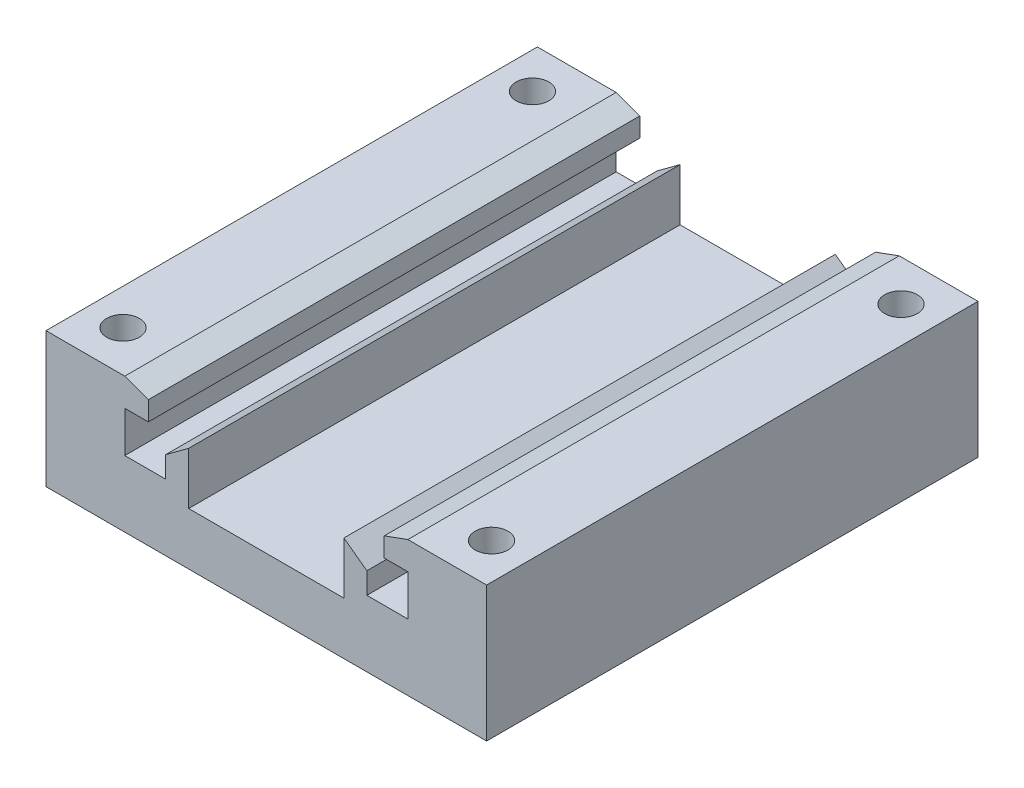
ISO-10303-21;
HEADER;
FILE_DESCRIPTION(('STEP AP214'),'2;1');
FILE_NAME('part.step','',(''),(''),'','','');
FILE_SCHEMA(('AUTOMOTIVE_DESIGN { 1 0 10303 214 1 1 1 1 }'));
ENDSEC;
DATA;
#1=APPLICATION_CONTEXT('core data for automotive mechanical design processes');
#2=APPLICATION_PROTOCOL_DEFINITION('international standard','automotive_design',2000,#1);
#3=PRODUCT_CONTEXT('',#1,'mechanical');
#4=PRODUCT('Part','Part','',(#3));
#5=PRODUCT_RELATED_PRODUCT_CATEGORY('part','',(#4));
#6=PRODUCT_DEFINITION_FORMATION('','',#4);
#7=PRODUCT_DEFINITION_CONTEXT('part definition',#1,'design');
#8=PRODUCT_DEFINITION('design','',#6,#7);
#9=PRODUCT_DEFINITION_SHAPE('','',#8);
#10=(LENGTH_UNIT() NAMED_UNIT(*) SI_UNIT(.MILLI.,.METRE.));
#11=(NAMED_UNIT(*) PLANE_ANGLE_UNIT() SI_UNIT($,.RADIAN.));
#12=(NAMED_UNIT(*) SI_UNIT($,.STERADIAN.) SOLID_ANGLE_UNIT());
#13=UNCERTAINTY_MEASURE_WITH_UNIT(LENGTH_MEASURE(1.E-05),#10,'distance_accuracy_value','');
#14=(GEOMETRIC_REPRESENTATION_CONTEXT(3) GLOBAL_UNCERTAINTY_ASSIGNED_CONTEXT((#13)) GLOBAL_UNIT_ASSIGNED_CONTEXT((#10,
#11,#12)) REPRESENTATION_CONTEXT('',''));
#15=CARTESIAN_POINT('',(0.,0.,0.));
#16=DIRECTION('',(0.,0.,1.));
#17=DIRECTION('',(1.,0.,0.));
#18=AXIS2_PLACEMENT_3D('',#15,#16,#17);
#19=CARTESIAN_POINT('',(53.8,16.5,-60.));
#20=DIRECTION('',(0.,1.,0.));
#21=DIRECTION('',(-1.,0.,0.));
#22=AXIS2_PLACEMENT_3D('',#19,#20,#21);
#23=PLANE('',#22);
#24=CARTESIAN_POINT('',(4.39999999999999,16.5,-55.));
#25=DIRECTION('',(0.,-1.,0.));
#26=DIRECTION('',(0.,0.,-1.));
#27=AXIS2_PLACEMENT_3D('',#24,#25,#26);
#28=CIRCLE('',#27,2.);
#29=CARTESIAN_POINT('',(4.39999999999999,16.5,-57.));
#30=VERTEX_POINT('',#29);
#31=EDGE_CURVE('E495',#30,#30,#28,.T.);
#32=ORIENTED_EDGE('',*,*,#31,.T.);
#33=EDGE_LOOP('',(#32));
#34=FACE_BOUND('',#33,.T.);
#35=DIRECTION('',(-1.,0.,0.));
#36=VECTOR('',#35,1.);
#37=CARTESIAN_POINT('',(53.8,16.5,0.));
#38=LINE('',#37,#36);
#39=CARTESIAN_POINT('',(9.62,16.5,0.));
#40=VERTEX_POINT('',#39);
#41=CARTESIAN_POINT('',(0.,16.5,0.));
#42=VERTEX_POINT('',#41);
#43=EDGE_CURVE('E402',#40,#42,#38,.T.);
#44=ORIENTED_EDGE('',*,*,#43,.F.);
#45=DIRECTION('',(0.,0.,1.));
#46=VECTOR('',#45,1.);
#47=CARTESIAN_POINT('',(9.62,16.5,-60.));
#48=LINE('',#47,#46);
#49=CARTESIAN_POINT('',(9.62,16.5,-60.));
#50=VERTEX_POINT('',#49);
#51=EDGE_CURVE('E416',#50,#40,#48,.T.);
#52=ORIENTED_EDGE('',*,*,#51,.F.);
#53=DIRECTION('',(-1.,0.,0.));
#54=VECTOR('',#53,1.);
#55=CARTESIAN_POINT('',(53.8,16.5,-60.));
#56=LINE('',#55,#54);
#57=CARTESIAN_POINT('',(0.,16.5,-60.));
#58=VERTEX_POINT('',#57);
#59=EDGE_CURVE('E465',#50,#58,#56,.T.);
#60=ORIENTED_EDGE('',*,*,#59,.T.);
#61=DIRECTION('',(0.,0.,1.));
#62=VECTOR('',#61,1.);
#63=CARTESIAN_POINT('',(0.,16.5,-60.));
#64=LINE('',#63,#62);
#65=EDGE_CURVE('E414',#58,#42,#64,.T.);
#66=ORIENTED_EDGE('',*,*,#65,.T.);
#67=EDGE_LOOP('',(#44,#52,#60,#66));
#68=FACE_BOUND('',#67,.T.);
#69=CARTESIAN_POINT('',(4.39999999999999,16.5,-5.));
#70=DIRECTION('',(0.,-1.,0.));
#71=DIRECTION('',(0.,0.,-1.));
#72=AXIS2_PLACEMENT_3D('',#69,#70,#71);
#73=CIRCLE('',#72,2.);
#74=CARTESIAN_POINT('',(4.39999999999999,16.5,-7.));
#75=VERTEX_POINT('',#74);
#76=EDGE_CURVE('E486',#75,#75,#73,.T.);
#77=ORIENTED_EDGE('',*,*,#76,.T.);
#78=EDGE_LOOP('',(#77));
#79=FACE_BOUND('',#78,.T.);
#80=ADVANCED_FACE('F40',(#34,#68,#79),#23,.T.);
#81=CARTESIAN_POINT('',(39.18,0.,-60.));
#82=DIRECTION('',(-1.,0.,0.));
#83=DIRECTION('',(0.,0.,1.));
#84=AXIS2_PLACEMENT_3D('',#81,#82,#83);
#85=PLANE('',#84);
#86=DIRECTION('',(0.,-1.,0.));
#87=VECTOR('',#86,1.);
#88=CARTESIAN_POINT('',(39.18,0.,0.));
#89=LINE('',#88,#87);
#90=CARTESIAN_POINT('',(39.18,10.7,0.));
#91=VERTEX_POINT('',#90);
#92=CARTESIAN_POINT('',(39.18,8.1,0.));
#93=VERTEX_POINT('',#92);
#94=EDGE_CURVE('E158',#91,#93,#89,.T.);
#95=ORIENTED_EDGE('',*,*,#94,.T.);
#96=DIRECTION('',(0.,0.,1.));
#97=VECTOR('',#96,1.);
#98=CARTESIAN_POINT('',(39.18,8.1,-60.));
#99=LINE('',#98,#97);
#100=CARTESIAN_POINT('',(39.18,8.1,-60.));
#101=VERTEX_POINT('',#100);
#102=EDGE_CURVE('E11',#101,#93,#99,.T.);
#103=ORIENTED_EDGE('',*,*,#102,.F.);
#104=DIRECTION('',(0.,-1.,0.));
#105=VECTOR('',#104,1.);
#106=CARTESIAN_POINT('',(39.18,0.,-60.));
#107=LINE('',#106,#105);
#108=CARTESIAN_POINT('',(39.18,10.7,-60.));
#109=VERTEX_POINT('',#108);
#110=EDGE_CURVE('E59',#109,#101,#107,.T.);
#111=ORIENTED_EDGE('',*,*,#110,.F.);
#112=DIRECTION('',(0.,0.,1.));
#113=VECTOR('',#112,1.);
#114=CARTESIAN_POINT('',(39.18,10.7,-60.));
#115=LINE('',#114,#113);
#116=EDGE_CURVE('E44',#109,#91,#115,.T.);
#117=ORIENTED_EDGE('',*,*,#116,.T.);
#118=EDGE_LOOP('',(#95,#103,#111,#117));
#119=FACE_BOUND('',#118,.T.);
#120=ADVANCED_FACE('F42',(#119),#85,.F.);
#121=CARTESIAN_POINT('',(0.,8.1,-60.));
#122=DIRECTION('',(0.,1.,0.));
#123=DIRECTION('',(0.,0.,1.));
#124=AXIS2_PLACEMENT_3D('',#121,#122,#123);
#125=PLANE('',#124);
#126=DIRECTION('',(-1.,0.,0.));
#127=VECTOR('',#126,1.);
#128=CARTESIAN_POINT('',(0.,8.1,0.));
#129=LINE('',#128,#127);
#130=CARTESIAN_POINT('',(44.18,8.1,0.));
#131=VERTEX_POINT('',#130);
#132=EDGE_CURVE('E188',#131,#93,#129,.T.);
#133=ORIENTED_EDGE('',*,*,#132,.F.);
#134=DIRECTION('',(0.,0.,1.));
#135=VECTOR('',#134,1.);
#136=CARTESIAN_POINT('',(44.18,8.1,-60.));
#137=LINE('',#136,#135);
#138=CARTESIAN_POINT('',(44.18,8.1,-60.));
#139=VERTEX_POINT('',#138);
#140=EDGE_CURVE('E50',#139,#131,#137,.T.);
#141=ORIENTED_EDGE('',*,*,#140,.F.);
#142=DIRECTION('',(-1.,0.,0.));
#143=VECTOR('',#142,1.);
#144=CARTESIAN_POINT('',(0.,8.1,-60.));
#145=LINE('',#144,#143);
#146=EDGE_CURVE('E153',#139,#101,#145,.T.);
#147=ORIENTED_EDGE('',*,*,#146,.T.);
#148=ORIENTED_EDGE('',*,*,#102,.T.);
#149=EDGE_LOOP('',(#133,#141,#147,#148));
#150=FACE_BOUND('',#149,.T.);
#151=ADVANCED_FACE('F226',(#150),#125,.T.);
#152=CARTESIAN_POINT('',(44.18,0.,-60.));
#153=DIRECTION('',(-1.,0.,0.));
#154=DIRECTION('',(0.,0.,1.));
#155=AXIS2_PLACEMENT_3D('',#152,#153,#154);
#156=PLANE('',#155);
#157=DIRECTION('',(0.,-1.,0.));
#158=VECTOR('',#157,1.);
#159=CARTESIAN_POINT('',(44.18,0.,0.));
#160=LINE('',#159,#158);
#161=CARTESIAN_POINT('',(44.18,13.1,0.));
#162=VERTEX_POINT('',#161);
#163=EDGE_CURVE('E139',#162,#131,#160,.T.);
#164=ORIENTED_EDGE('',*,*,#163,.F.);
#165=DIRECTION('',(0.,0.,1.));
#166=VECTOR('',#165,1.);
#167=CARTESIAN_POINT('',(44.18,13.1,-60.));
#168=LINE('',#167,#166);
#169=CARTESIAN_POINT('',(44.18,13.1,-60.));
#170=VERTEX_POINT('',#169);
#171=EDGE_CURVE('E134',#170,#162,#168,.T.);
#172=ORIENTED_EDGE('',*,*,#171,.F.);
#173=DIRECTION('',(0.,-1.,0.));
#174=VECTOR('',#173,1.);
#175=CARTESIAN_POINT('',(44.18,0.,-60.));
#176=LINE('',#175,#174);
#177=EDGE_CURVE('E138',#170,#139,#176,.T.);
#178=ORIENTED_EDGE('',*,*,#177,.T.);
#179=ORIENTED_EDGE('',*,*,#140,.T.);
#180=EDGE_LOOP('',(#164,#172,#178,#179));
#181=FACE_BOUND('',#180,.T.);
#182=ADVANCED_FACE('F136',(#181),#156,.T.);
#183=CARTESIAN_POINT('',(0.,13.1,-60.));
#184=DIRECTION('',(0.,1.,0.));
#185=DIRECTION('',(0.,0.,1.));
#186=AXIS2_PLACEMENT_3D('',#183,#184,#185);
#187=PLANE('',#186);
#188=DIRECTION('',(-1.,0.,0.));
#189=VECTOR('',#188,1.);
#190=CARTESIAN_POINT('',(0.,13.1,0.));
#191=LINE('',#190,#189);
#192=CARTESIAN_POINT('',(41.3,13.1,0.));
#193=VERTEX_POINT('',#192);
#194=EDGE_CURVE('E185',#162,#193,#191,.T.);
#195=ORIENTED_EDGE('',*,*,#194,.T.);
#196=DIRECTION('',(0.,0.,1.));
#197=VECTOR('',#196,1.);
#198=CARTESIAN_POINT('',(41.3,13.1,-60.));
#199=LINE('',#198,#197);
#200=CARTESIAN_POINT('',(41.3,13.1,-60.));
#201=VERTEX_POINT('',#200);
#202=EDGE_CURVE('E143',#201,#193,#199,.T.);
#203=ORIENTED_EDGE('',*,*,#202,.F.);
#204=DIRECTION('',(-1.,0.,0.));
#205=VECTOR('',#204,1.);
#206=CARTESIAN_POINT('',(0.,13.1,-60.));
#207=LINE('',#206,#205);
#208=EDGE_CURVE('E146',#170,#201,#207,.T.);
#209=ORIENTED_EDGE('',*,*,#208,.F.);
#210=ORIENTED_EDGE('',*,*,#171,.T.);
#211=EDGE_LOOP('',(#195,#203,#209,#210));
#212=FACE_BOUND('',#211,.T.);
#213=ADVANCED_FACE('F147',(#212),#187,.F.);
#214=CARTESIAN_POINT('',(41.3,0.,-60.));
#215=DIRECTION('',(-1.,0.,0.));
#216=DIRECTION('',(0.,0.,1.));
#217=AXIS2_PLACEMENT_3D('',#214,#215,#216);
#218=PLANE('',#217);
#219=DIRECTION('',(0.,-1.,0.));
#220=VECTOR('',#219,1.);
#221=CARTESIAN_POINT('',(41.3,0.,0.));
#222=LINE('',#221,#220);
#223=CARTESIAN_POINT('',(41.3,15.4517657253134,0.));
#224=VERTEX_POINT('',#223);
#225=EDGE_CURVE('E182',#224,#193,#222,.T.);
#226=ORIENTED_EDGE('',*,*,#225,.F.);
#227=DIRECTION('',(0.,0.,1.));
#228=VECTOR('',#227,1.);
#229=CARTESIAN_POINT('',(41.3,15.4517657253134,-60.));
#230=LINE('',#229,#228);
#231=CARTESIAN_POINT('',(41.3,15.4517657253134,-60.));
#232=VERTEX_POINT('',#231);
#233=EDGE_CURVE('E193',#232,#224,#230,.T.);
#234=ORIENTED_EDGE('',*,*,#233,.F.);
#235=DIRECTION('',(0.,-1.,0.));
#236=VECTOR('',#235,1.);
#237=CARTESIAN_POINT('',(41.3,0.,-60.));
#238=LINE('',#237,#236);
#239=EDGE_CURVE('E150',#232,#201,#238,.T.);
#240=ORIENTED_EDGE('',*,*,#239,.T.);
#241=ORIENTED_EDGE('',*,*,#202,.T.);
#242=EDGE_LOOP('',(#226,#234,#240,#241));
#243=FACE_BOUND('',#242,.T.);
#244=ADVANCED_FACE('F267',(#243),#218,.T.);
#245=CARTESIAN_POINT('',(-0.134919528412264,0.370688357756169,-60.));
#246=DIRECTION('',(-0.342020143325663,0.93969262078591,0.));
#247=DIRECTION('',(-0.93969262078591,-0.342020143325663,0.));
#248=AXIS2_PLACEMENT_3D('',#245,#246,#247);
#249=PLANE('',#248);
#250=DIRECTION('',(-0.93969262078591,-0.342020143325663,0.));
#251=VECTOR('',#250,1.);
#252=CARTESIAN_POINT('',(-0.134919528412264,0.370688357756169,0.));
#253=LINE('',#252,#251);
#254=CARTESIAN_POINT('',(44.18,16.5,0.));
#255=VERTEX_POINT('',#254);
#256=EDGE_CURVE('E179',#255,#224,#253,.T.);
#257=ORIENTED_EDGE('',*,*,#256,.F.);
#258=DIRECTION('',(0.,0.,1.));
#259=VECTOR('',#258,1.);
#260=CARTESIAN_POINT('',(44.18,16.5,-60.));
#261=LINE('',#260,#259);
#262=CARTESIAN_POINT('',(44.18,16.5,-60.));
#263=VERTEX_POINT('',#262);
#264=EDGE_CURVE('E195',#263,#255,#261,.T.);
#265=ORIENTED_EDGE('',*,*,#264,.F.);
#266=DIRECTION('',(-0.93969262078591,-0.342020143325663,0.));
#267=VECTOR('',#266,1.);
#268=CARTESIAN_POINT('',(-0.134919528412264,0.370688357756169,-60.));
#269=LINE('',#268,#267);
#270=EDGE_CURVE('E444',#263,#232,#269,.T.);
#271=ORIENTED_EDGE('',*,*,#270,.T.);
#272=ORIENTED_EDGE('',*,*,#233,.T.);
#273=EDGE_LOOP('',(#257,#265,#271,#272));
#274=FACE_BOUND('',#273,.T.);
#275=ADVANCED_FACE('F270',(#274),#249,.T.);
#276=CARTESIAN_POINT('',(0.,16.5,-60.));
#277=DIRECTION('',(0.,-1.,0.));
#278=DIRECTION('',(0.,0.,-1.));
#279=AXIS2_PLACEMENT_3D('',#276,#277,#278);
#280=PLANE('',#279);
#281=CARTESIAN_POINT('',(49.4,16.5,-55.));
#282=DIRECTION('',(0.,-1.,0.));
#283=DIRECTION('',(0.,0.,-1.));
#284=AXIS2_PLACEMENT_3D('',#281,#282,#283);
#285=CIRCLE('',#284,1.99999999999999);
#286=CARTESIAN_POINT('',(49.4,16.5,-57.));
#287=VERTEX_POINT('',#286);
#288=EDGE_CURVE('E503',#287,#287,#285,.T.);
#289=ORIENTED_EDGE('',*,*,#288,.T.);
#290=EDGE_LOOP('',(#289));
#291=FACE_BOUND('',#290,.T.);
#292=CARTESIAN_POINT('',(49.4,16.5,-5.));
#293=DIRECTION('',(0.,-1.,0.));
#294=DIRECTION('',(0.,0.,-1.));
#295=AXIS2_PLACEMENT_3D('',#292,#293,#294);
#296=CIRCLE('',#295,1.99999999999999);
#297=CARTESIAN_POINT('',(49.4,16.5,-6.99999999999999));
#298=VERTEX_POINT('',#297);
#299=EDGE_CURVE('E383',#298,#298,#296,.T.);
#300=ORIENTED_EDGE('',*,*,#299,.T.);
#301=EDGE_LOOP('',(#300));
#302=FACE_BOUND('',#301,.T.);
#303=DIRECTION('',(1.,0.,0.));
#304=VECTOR('',#303,1.);
#305=CARTESIAN_POINT('',(0.,16.5,0.));
#306=LINE('',#305,#304);
#307=CARTESIAN_POINT('',(53.8,16.5,0.));
#308=VERTEX_POINT('',#307);
#309=EDGE_CURVE('E176',#255,#308,#306,.T.);
#310=ORIENTED_EDGE('',*,*,#309,.T.);
#311=DIRECTION('',(0.,0.,1.));
#312=VECTOR('',#311,1.);
#313=CARTESIAN_POINT('',(53.8,16.5,-60.));
#314=LINE('',#313,#312);
#315=CARTESIAN_POINT('',(53.8,16.5,-60.));
#316=VERTEX_POINT('',#315);
#317=EDGE_CURVE('E197',#316,#308,#314,.T.);
#318=ORIENTED_EDGE('',*,*,#317,.F.);
#319=DIRECTION('',(1.,0.,0.));
#320=VECTOR('',#319,1.);
#321=CARTESIAN_POINT('',(0.,16.5,-60.));
#322=LINE('',#321,#320);
#323=EDGE_CURVE('E442',#263,#316,#322,.T.);
#324=ORIENTED_EDGE('',*,*,#323,.F.);
#325=ORIENTED_EDGE('',*,*,#264,.T.);
#326=EDGE_LOOP('',(#310,#318,#324,#325));
#327=FACE_BOUND('',#326,.T.);
#328=ADVANCED_FACE('F274',(#291,#302,#327),#280,.F.);
#329=CARTESIAN_POINT('',(53.8,0.,-60.));
#330=DIRECTION('',(1.,0.,0.));
#331=DIRECTION('',(0.,1.,0.));
#332=AXIS2_PLACEMENT_3D('',#329,#330,#331);
#333=PLANE('',#332);
#334=DIRECTION('',(0.,1.,0.));
#335=VECTOR('',#334,1.);
#336=CARTESIAN_POINT('',(53.8,0.,0.));
#337=LINE('',#336,#335);
#338=CARTESIAN_POINT('',(53.8,0.,0.));
#339=VERTEX_POINT('',#338);
#340=EDGE_CURVE('E173',#339,#308,#337,.T.);
#341=ORIENTED_EDGE('',*,*,#340,.F.);
#342=DIRECTION('',(0.,0.,1.));
#343=VECTOR('',#342,1.);
#344=CARTESIAN_POINT('',(53.8,0.,-60.));
#345=LINE('',#344,#343);
#346=CARTESIAN_POINT('',(53.8,0.,-60.));
#347=VERTEX_POINT('',#346);
#348=EDGE_CURVE('E199',#347,#339,#345,.T.);
#349=ORIENTED_EDGE('',*,*,#348,.F.);
#350=DIRECTION('',(0.,1.,0.));
#351=VECTOR('',#350,1.);
#352=CARTESIAN_POINT('',(53.8,0.,-60.));
#353=LINE('',#352,#351);
#354=EDGE_CURVE('E439',#347,#316,#353,.T.);
#355=ORIENTED_EDGE('',*,*,#354,.T.);
#356=ORIENTED_EDGE('',*,*,#317,.T.);
#357=EDGE_LOOP('',(#341,#349,#355,#356));
#358=FACE_BOUND('',#357,.T.);
#359=ADVANCED_FACE('F278',(#358),#333,.T.);
#360=CARTESIAN_POINT('',(0.,0.,-60.));
#361=DIRECTION('',(0.,-1.,0.));
#362=DIRECTION('',(0.,0.,-1.));
#363=AXIS2_PLACEMENT_3D('',#360,#361,#362);
#364=PLANE('',#363);
#365=CARTESIAN_POINT('',(49.4,0.,-55.));
#366=DIRECTION('',(0.,-1.,0.));
#367=DIRECTION('',(0.,0.,-1.));
#368=AXIS2_PLACEMENT_3D('',#365,#366,#367);
#369=CIRCLE('',#368,2.025);
#370=CARTESIAN_POINT('',(49.4,0.,-57.025));
#371=VERTEX_POINT('',#370);
#372=EDGE_CURVE('E509',#371,#371,#369,.T.);
#373=ORIENTED_EDGE('',*,*,#372,.F.);
#374=EDGE_LOOP('',(#373));
#375=FACE_BOUND('',#374,.T.);
#376=CARTESIAN_POINT('',(4.39999999999999,0.,-55.));
#377=DIRECTION('',(0.,-1.,0.));
#378=DIRECTION('',(0.,0.,-1.));
#379=AXIS2_PLACEMENT_3D('',#376,#377,#378);
#380=CIRCLE('',#379,2.025);
#381=CARTESIAN_POINT('',(4.39999999999999,0.,-57.025));
#382=VERTEX_POINT('',#381);
#383=EDGE_CURVE('E500',#382,#382,#380,.T.);
#384=ORIENTED_EDGE('',*,*,#383,.F.);
#385=EDGE_LOOP('',(#384));
#386=FACE_BOUND('',#385,.T.);
#387=CARTESIAN_POINT('',(4.39999999999999,0.,-5.));
#388=DIRECTION('',(0.,-1.,0.));
#389=DIRECTION('',(0.,0.,-1.));
#390=AXIS2_PLACEMENT_3D('',#387,#388,#389);
#391=CIRCLE('',#390,2.025);
#392=CARTESIAN_POINT('',(4.39999999999999,0.,-7.025));
#393=VERTEX_POINT('',#392);
#394=EDGE_CURVE('E492',#393,#393,#391,.T.);
#395=ORIENTED_EDGE('',*,*,#394,.F.);
#396=EDGE_LOOP('',(#395));
#397=FACE_BOUND('',#396,.T.);
#398=CARTESIAN_POINT('',(49.4,0.,-5.));
#399=DIRECTION('',(0.,-1.,0.));
#400=DIRECTION('',(0.,0.,-1.));
#401=AXIS2_PLACEMENT_3D('',#398,#399,#400);
#402=CIRCLE('',#401,2.025);
#403=CARTESIAN_POINT('',(49.4,0.,-7.025));
#404=VERTEX_POINT('',#403);
#405=EDGE_CURVE('E483',#404,#404,#402,.T.);
#406=ORIENTED_EDGE('',*,*,#405,.F.);
#407=EDGE_LOOP('',(#406));
#408=FACE_BOUND('',#407,.T.);
#409=DIRECTION('',(1.,0.,0.));
#410=VECTOR('',#409,1.);
#411=CARTESIAN_POINT('',(0.,0.,0.));
#412=LINE('',#411,#410);
#413=CARTESIAN_POINT('',(0.,0.,0.));
#414=VERTEX_POINT('',#413);
#415=EDGE_CURVE('E170',#414,#339,#412,.T.);
#416=ORIENTED_EDGE('',*,*,#415,.F.);
#417=DIRECTION('',(0.,0.,1.));
#418=VECTOR('',#417,1.);
#419=CARTESIAN_POINT('',(0.,0.,-60.));
#420=LINE('',#419,#418);
#421=CARTESIAN_POINT('',(0.,0.,-60.));
#422=VERTEX_POINT('',#421);
#423=EDGE_CURVE('E411',#422,#414,#420,.T.);
#424=ORIENTED_EDGE('',*,*,#423,.F.);
#425=DIRECTION('',(1.,0.,0.));
#426=VECTOR('',#425,1.);
#427=CARTESIAN_POINT('',(0.,0.,-60.));
#428=LINE('',#427,#426);
#429=EDGE_CURVE('E436',#422,#347,#428,.T.);
#430=ORIENTED_EDGE('',*,*,#429,.T.);
#431=ORIENTED_EDGE('',*,*,#348,.T.);
#432=EDGE_LOOP('',(#416,#424,#430,#431));
#433=FACE_BOUND('',#432,.T.);
#434=ADVANCED_FACE('F282',(#375,#386,#397,#408,#433),#364,.T.);
#435=CARTESIAN_POINT('',(0.,6.4,-60.));
#436=DIRECTION('',(0.,1.,0.));
#437=DIRECTION('',(-1.,0.,0.));
#438=AXIS2_PLACEMENT_3D('',#435,#436,#437);
#439=PLANE('',#438);
#440=DIRECTION('',(-1.,0.,0.));
#441=VECTOR('',#440,1.);
#442=CARTESIAN_POINT('',(0.,6.4,0.));
#443=LINE('',#442,#441);
#444=CARTESIAN_POINT('',(36.38,6.4,0.));
#445=VERTEX_POINT('',#444);
#446=CARTESIAN_POINT('',(17.42,6.40000000000001,0.));
#447=VERTEX_POINT('',#446);
#448=EDGE_CURVE('E167',#445,#447,#443,.T.);
#449=ORIENTED_EDGE('',*,*,#448,.F.);
#450=DIRECTION('',(0.,0.,1.));
#451=VECTOR('',#450,1.);
#452=CARTESIAN_POINT('',(36.38,6.4,-60.));
#453=LINE('',#452,#451);
#454=CARTESIAN_POINT('',(36.38,6.4,-60.));
#455=VERTEX_POINT('',#454);
#456=EDGE_CURVE('E201',#455,#445,#453,.T.);
#457=ORIENTED_EDGE('',*,*,#456,.F.);
#458=DIRECTION('',(-1.,0.,0.));
#459=VECTOR('',#458,1.);
#460=CARTESIAN_POINT('',(0.,6.4,-60.));
#461=LINE('',#460,#459);
#462=CARTESIAN_POINT('',(17.42,6.40000000000001,-60.));
#463=VERTEX_POINT('',#462);
#464=EDGE_CURVE('E434',#455,#463,#461,.T.);
#465=ORIENTED_EDGE('',*,*,#464,.T.);
#466=DIRECTION('',(0.,0.,1.));
#467=VECTOR('',#466,1.);
#468=CARTESIAN_POINT('',(17.42,6.40000000000001,-60.));
#469=LINE('',#468,#467);
#470=EDGE_CURVE('E297',#463,#447,#469,.T.);
#471=ORIENTED_EDGE('',*,*,#470,.T.);
#472=EDGE_LOOP('',(#449,#457,#465,#471));
#473=FACE_BOUND('',#472,.T.);
#474=ADVANCED_FACE('F217',(#473),#439,.T.);
#475=CARTESIAN_POINT('',(36.38,0.,-60.));
#476=DIRECTION('',(1.,0.,0.));
#477=DIRECTION('',(0.,0.,-1.));
#478=AXIS2_PLACEMENT_3D('',#475,#476,#477);
#479=PLANE('',#478);
#480=DIRECTION('',(0.,1.,0.));
#481=VECTOR('',#480,1.);
#482=CARTESIAN_POINT('',(36.38,0.,0.));
#483=LINE('',#482,#481);
#484=CARTESIAN_POINT('',(36.38,12.7666018858185,0.));
#485=VERTEX_POINT('',#484);
#486=EDGE_CURVE('E164',#445,#485,#483,.T.);
#487=ORIENTED_EDGE('',*,*,#486,.T.);
#488=DIRECTION('',(0.,0.,1.));
#489=VECTOR('',#488,1.);
#490=CARTESIAN_POINT('',(36.38,12.7666018858185,-60.));
#491=LINE('',#490,#489);
#492=CARTESIAN_POINT('',(36.38,12.7666018858185,-60.));
#493=VERTEX_POINT('',#492);
#494=EDGE_CURVE('E202',#493,#485,#491,.T.);
#495=ORIENTED_EDGE('',*,*,#494,.F.);
#496=DIRECTION('',(0.,1.,0.));
#497=VECTOR('',#496,1.);
#498=CARTESIAN_POINT('',(36.38,0.,-60.));
#499=LINE('',#498,#497);
#500=EDGE_CURVE('E432',#455,#493,#499,.T.);
#501=ORIENTED_EDGE('',*,*,#500,.F.);
#502=ORIENTED_EDGE('',*,*,#456,.T.);
#503=EDGE_LOOP('',(#487,#495,#501,#502));
#504=FACE_BOUND('',#503,.T.);
#505=ADVANCED_FACE('F211',(#504),#479,.F.);
#506=CARTESIAN_POINT('',(18.9290727670596,25.6466444318453,-60.));
#507=DIRECTION('',(0.593840246646651,0.804582973634569,0.));
#508=DIRECTION('',(-0.804582973634569,0.593840246646651,0.));
#509=AXIS2_PLACEMENT_3D('',#506,#507,#508);
#510=PLANE('',#509);
#511=DIRECTION('',(-0.804582973634569,0.593840246646651,0.));
#512=VECTOR('',#511,1.);
#513=CARTESIAN_POINT('',(18.9290727670596,25.6466444318453,0.));
#514=LINE('',#513,#512);
#515=EDGE_CURVE('E160',#91,#485,#514,.T.);
#516=ORIENTED_EDGE('',*,*,#515,.F.);
#517=ORIENTED_EDGE('',*,*,#116,.F.);
#518=DIRECTION('',(-0.804582973634569,0.593840246646651,0.));
#519=VECTOR('',#518,1.);
#520=CARTESIAN_POINT('',(18.9290727670596,25.6466444318453,-60.));
#521=LINE('',#520,#519);
#522=EDGE_CURVE('E430',#109,#493,#521,.T.);
#523=ORIENTED_EDGE('',*,*,#522,.T.);
#524=ORIENTED_EDGE('',*,*,#494,.T.);
#525=EDGE_LOOP('',(#516,#517,#523,#524));
#526=FACE_BOUND('',#525,.T.);
#527=ADVANCED_FACE('F209',(#526),#510,.T.);
#528=CARTESIAN_POINT('',(0.,0.,-60.));
#529=DIRECTION('',(0.,0.,1.));
#530=DIRECTION('',(1.,0.,0.));
#531=AXIS2_PLACEMENT_3D('',#528,#529,#530);
#532=PLANE('',#531);
#533=ORIENTED_EDGE('',*,*,#110,.T.);
#534=ORIENTED_EDGE('',*,*,#146,.F.);
#535=ORIENTED_EDGE('',*,*,#177,.F.);
#536=ORIENTED_EDGE('',*,*,#208,.T.);
#537=ORIENTED_EDGE('',*,*,#239,.F.);
#538=ORIENTED_EDGE('',*,*,#270,.F.);
#539=ORIENTED_EDGE('',*,*,#323,.T.);
#540=ORIENTED_EDGE('',*,*,#354,.F.);
#541=ORIENTED_EDGE('',*,*,#429,.F.);
#542=DIRECTION('',(0.,1.,0.));
#543=VECTOR('',#542,1.);
#544=CARTESIAN_POINT('',(0.,0.,-60.));
#545=LINE('',#544,#543);
#546=EDGE_CURVE('E461',#422,#58,#545,.T.);
#547=ORIENTED_EDGE('',*,*,#546,.T.);
#548=ORIENTED_EDGE('',*,*,#59,.F.);
#549=DIRECTION('',(0.93969262078591,-0.342020143325664,0.));
#550=VECTOR('',#549,1.);
#551=CARTESIAN_POINT('',(53.9349195284123,0.370688357756158,-60.));
#552=LINE('',#551,#550);
#553=CARTESIAN_POINT('',(12.5,15.4517657253134,-60.));
#554=VERTEX_POINT('',#553);
#555=EDGE_CURVE('E468',#50,#554,#552,.T.);
#556=ORIENTED_EDGE('',*,*,#555,.T.);
#557=DIRECTION('',(0.,-1.,0.));
#558=VECTOR('',#557,1.);
#559=CARTESIAN_POINT('',(12.5,0.,-60.));
#560=LINE('',#559,#558);
#561=CARTESIAN_POINT('',(12.5,13.1,-60.));
#562=VERTEX_POINT('',#561);
#563=EDGE_CURVE('E472',#554,#562,#560,.T.);
#564=ORIENTED_EDGE('',*,*,#563,.T.);
#565=DIRECTION('',(1.,0.,0.));
#566=VECTOR('',#565,1.);
#567=CARTESIAN_POINT('',(53.8,13.1,-60.));
#568=LINE('',#567,#566);
#569=CARTESIAN_POINT('',(9.62,13.1,-60.));
#570=VERTEX_POINT('',#569);
#571=EDGE_CURVE('E474',#570,#562,#568,.T.);
#572=ORIENTED_EDGE('',*,*,#571,.F.);
#573=DIRECTION('',(0.,-1.,0.));
#574=VECTOR('',#573,1.);
#575=CARTESIAN_POINT('',(9.61999999999999,0.,-60.));
#576=LINE('',#575,#574);
#577=CARTESIAN_POINT('',(9.62,8.10000000000001,-60.));
#578=VERTEX_POINT('',#577);
#579=EDGE_CURVE('E477',#570,#578,#576,.T.);
#580=ORIENTED_EDGE('',*,*,#579,.T.);
#581=DIRECTION('',(1.,0.,0.));
#582=VECTOR('',#581,1.);
#583=CARTESIAN_POINT('',(53.8,8.09999999999999,-60.));
#584=LINE('',#583,#582);
#585=CARTESIAN_POINT('',(14.62,8.1,-60.));
#586=VERTEX_POINT('',#585);
#587=EDGE_CURVE('E362',#578,#586,#584,.T.);
#588=ORIENTED_EDGE('',*,*,#587,.T.);
#589=DIRECTION('',(0.,-1.,0.));
#590=VECTOR('',#589,1.);
#591=CARTESIAN_POINT('',(14.62,0.,-60.));
#592=LINE('',#591,#590);
#593=CARTESIAN_POINT('',(14.62,10.7,-60.));
#594=VERTEX_POINT('',#593);
#595=EDGE_CURVE('E378',#594,#586,#592,.T.);
#596=ORIENTED_EDGE('',*,*,#595,.F.);
#597=DIRECTION('',(0.804582973634569,0.59384024664665,0.));
#598=VECTOR('',#597,1.);
#599=CARTESIAN_POINT('',(34.8709272329404,25.6466444318453,-60.));
#600=LINE('',#599,#598);
#601=CARTESIAN_POINT('',(17.42,12.7666018858185,-60.));
#602=VERTEX_POINT('',#601);
#603=EDGE_CURVE('E370',#594,#602,#600,.T.);
#604=ORIENTED_EDGE('',*,*,#603,.T.);
#605=DIRECTION('',(0.,1.,0.));
#606=VECTOR('',#605,1.);
#607=CARTESIAN_POINT('',(17.42,0.,-60.));
#608=LINE('',#607,#606);
#609=EDGE_CURVE('E464',#463,#602,#608,.T.);
#610=ORIENTED_EDGE('',*,*,#609,.F.);
#611=ORIENTED_EDGE('',*,*,#464,.F.);
#612=ORIENTED_EDGE('',*,*,#500,.T.);
#613=ORIENTED_EDGE('',*,*,#522,.F.);
#614=EDGE_LOOP('',(#533,#534,#535,#536,#537,#538,#539,#540,#541,#547,#548,#556,#564,#572,#580,
#588,#596,#604,#610,#611,#612,#613));
#615=FACE_BOUND('',#614,.T.);
#616=ADVANCED_FACE('F152',(#615),#532,.F.);
#617=CARTESIAN_POINT('',(0.,0.,0.));
#618=DIRECTION('',(0.,0.,1.));
#619=DIRECTION('',(1.,0.,0.));
#620=AXIS2_PLACEMENT_3D('',#617,#618,#619);
#621=PLANE('',#620);
#622=ORIENTED_EDGE('',*,*,#94,.F.);
#623=ORIENTED_EDGE('',*,*,#515,.T.);
#624=ORIENTED_EDGE('',*,*,#486,.F.);
#625=ORIENTED_EDGE('',*,*,#448,.T.);
#626=DIRECTION('',(0.,1.,0.));
#627=VECTOR('',#626,1.);
#628=CARTESIAN_POINT('',(17.42,0.,0.));
#629=LINE('',#628,#627);
#630=CARTESIAN_POINT('',(17.42,12.7666018858185,0.));
#631=VERTEX_POINT('',#630);
#632=EDGE_CURVE('E302',#447,#631,#629,.T.);
#633=ORIENTED_EDGE('',*,*,#632,.T.);
#634=DIRECTION('',(0.804582973634569,0.59384024664665,0.));
#635=VECTOR('',#634,1.);
#636=CARTESIAN_POINT('',(34.8709272329404,25.6466444318453,0.));
#637=LINE('',#636,#635);
#638=CARTESIAN_POINT('',(14.62,10.7,0.));
#639=VERTEX_POINT('',#638);
#640=EDGE_CURVE('E369',#639,#631,#637,.T.);
#641=ORIENTED_EDGE('',*,*,#640,.F.);
#642=DIRECTION('',(0.,-1.,0.));
#643=VECTOR('',#642,1.);
#644=CARTESIAN_POINT('',(14.62,0.,0.));
#645=LINE('',#644,#643);
#646=CARTESIAN_POINT('',(14.62,8.1,0.));
#647=VERTEX_POINT('',#646);
#648=EDGE_CURVE('E377',#639,#647,#645,.T.);
#649=ORIENTED_EDGE('',*,*,#648,.T.);
#650=DIRECTION('',(1.,0.,0.));
#651=VECTOR('',#650,1.);
#652=CARTESIAN_POINT('',(53.8,8.09999999999999,0.));
#653=LINE('',#652,#651);
#654=CARTESIAN_POINT('',(9.62,8.10000000000001,0.));
#655=VERTEX_POINT('',#654);
#656=EDGE_CURVE('E382',#655,#647,#653,.T.);
#657=ORIENTED_EDGE('',*,*,#656,.F.);
#658=DIRECTION('',(0.,-1.,0.));
#659=VECTOR('',#658,1.);
#660=CARTESIAN_POINT('',(9.61999999999999,0.,0.));
#661=LINE('',#660,#659);
#662=CARTESIAN_POINT('',(9.62,13.1,0.));
#663=VERTEX_POINT('',#662);
#664=EDGE_CURVE('E385',#663,#655,#661,.T.);
#665=ORIENTED_EDGE('',*,*,#664,.F.);
#666=DIRECTION('',(1.,0.,0.));
#667=VECTOR('',#666,1.);
#668=CARTESIAN_POINT('',(53.8,13.1,0.));
#669=LINE('',#668,#667);
#670=CARTESIAN_POINT('',(12.5,13.1,0.));
#671=VERTEX_POINT('',#670);
#672=EDGE_CURVE('E394',#663,#671,#669,.T.);
#673=ORIENTED_EDGE('',*,*,#672,.T.);
#674=DIRECTION('',(0.,-1.,0.));
#675=VECTOR('',#674,1.);
#676=CARTESIAN_POINT('',(12.5,0.,0.));
#677=LINE('',#676,#675);
#678=CARTESIAN_POINT('',(12.5,15.4517657253134,0.));
#679=VERTEX_POINT('',#678);
#680=EDGE_CURVE('E397',#679,#671,#677,.T.);
#681=ORIENTED_EDGE('',*,*,#680,.F.);
#682=DIRECTION('',(0.93969262078591,-0.342020143325664,0.));
#683=VECTOR('',#682,1.);
#684=CARTESIAN_POINT('',(53.9349195284123,0.370688357756158,0.));
#685=LINE('',#684,#683);
#686=EDGE_CURVE('E400',#40,#679,#685,.T.);
#687=ORIENTED_EDGE('',*,*,#686,.F.);
#688=ORIENTED_EDGE('',*,*,#43,.T.);
#689=DIRECTION('',(0.,1.,0.));
#690=VECTOR('',#689,1.);
#691=CARTESIAN_POINT('',(0.,0.,0.));
#692=LINE('',#691,#690);
#693=EDGE_CURVE('E405',#414,#42,#692,.T.);
#694=ORIENTED_EDGE('',*,*,#693,.F.);
#695=ORIENTED_EDGE('',*,*,#415,.T.);
#696=ORIENTED_EDGE('',*,*,#340,.T.);
#697=ORIENTED_EDGE('',*,*,#309,.F.);
#698=ORIENTED_EDGE('',*,*,#256,.T.);
#699=ORIENTED_EDGE('',*,*,#225,.T.);
#700=ORIENTED_EDGE('',*,*,#194,.F.);
#701=ORIENTED_EDGE('',*,*,#163,.T.);
#702=ORIENTED_EDGE('',*,*,#132,.T.);
#703=EDGE_LOOP('',(#622,#623,#624,#625,#633,#641,#649,#657,#665,#673,#681,#687,#688,#694,#695,
#696,#697,#698,#699,#700,#701,#702));
#704=FACE_BOUND('',#703,.T.);
#705=ADVANCED_FACE('F207',(#704),#621,.T.);
#706=CARTESIAN_POINT('',(14.62,0.,-60.));
#707=DIRECTION('',(-1.,0.,0.));
#708=DIRECTION('',(0.,-1.,0.));
#709=AXIS2_PLACEMENT_3D('',#706,#707,#708);
#710=PLANE('',#709);
#711=ORIENTED_EDGE('',*,*,#648,.F.);
#712=DIRECTION('',(0.,0.,1.));
#713=VECTOR('',#712,1.);
#714=CARTESIAN_POINT('',(14.62,10.7,-60.));
#715=LINE('',#714,#713);
#716=EDGE_CURVE('E161',#594,#639,#715,.T.);
#717=ORIENTED_EDGE('',*,*,#716,.F.);
#718=ORIENTED_EDGE('',*,*,#595,.T.);
#719=DIRECTION('',(0.,0.,1.));
#720=VECTOR('',#719,1.);
#721=CARTESIAN_POINT('',(14.62,8.1,-60.));
#722=LINE('',#721,#720);
#723=EDGE_CURVE('E380',#586,#647,#722,.T.);
#724=ORIENTED_EDGE('',*,*,#723,.T.);
#725=EDGE_LOOP('',(#711,#717,#718,#724));
#726=FACE_BOUND('',#725,.T.);
#727=ADVANCED_FACE('F254',(#726),#710,.T.);
#728=CARTESIAN_POINT('',(34.8709272329404,25.6466444318453,-60.));
#729=DIRECTION('',(0.59384024664665,-0.804582973634569,0.));
#730=DIRECTION('',(0.804582973634569,0.59384024664665,0.));
#731=AXIS2_PLACEMENT_3D('',#728,#729,#730);
#732=PLANE('',#731);
#733=ORIENTED_EDGE('',*,*,#640,.T.);
#734=DIRECTION('',(0.,0.,1.));
#735=VECTOR('',#734,1.);
#736=CARTESIAN_POINT('',(17.42,12.7666018858185,-60.));
#737=LINE('',#736,#735);
#738=EDGE_CURVE('E373',#602,#631,#737,.T.);
#739=ORIENTED_EDGE('',*,*,#738,.F.);
#740=ORIENTED_EDGE('',*,*,#603,.F.);
#741=ORIENTED_EDGE('',*,*,#716,.T.);
#742=EDGE_LOOP('',(#733,#739,#740,#741));
#743=FACE_BOUND('',#742,.T.);
#744=ADVANCED_FACE('F256',(#743),#732,.F.);
#745=CARTESIAN_POINT('',(17.42,0.,-60.));
#746=DIRECTION('',(1.,0.,0.));
#747=DIRECTION('',(0.,1.,0.));
#748=AXIS2_PLACEMENT_3D('',#745,#746,#747);
#749=PLANE('',#748);
#750=ORIENTED_EDGE('',*,*,#632,.F.);
#751=ORIENTED_EDGE('',*,*,#470,.F.);
#752=ORIENTED_EDGE('',*,*,#609,.T.);
#753=ORIENTED_EDGE('',*,*,#738,.T.);
#754=EDGE_LOOP('',(#750,#751,#752,#753));
#755=FACE_BOUND('',#754,.T.);
#756=ADVANCED_FACE('F539',(#755),#749,.T.);
#757=CARTESIAN_POINT('',(0.,0.,-60.));
#758=DIRECTION('',(1.,0.,0.));
#759=DIRECTION('',(0.,1.,0.));
#760=AXIS2_PLACEMENT_3D('',#757,#758,#759);
#761=PLANE('',#760);
#762=ORIENTED_EDGE('',*,*,#693,.T.);
#763=ORIENTED_EDGE('',*,*,#65,.F.);
#764=ORIENTED_EDGE('',*,*,#546,.F.);
#765=ORIENTED_EDGE('',*,*,#423,.T.);
#766=EDGE_LOOP('',(#762,#763,#764,#765));
#767=FACE_BOUND('',#766,.T.);
#768=ADVANCED_FACE('F231',(#767),#761,.F.);
#769=CARTESIAN_POINT('',(53.9349195284123,0.370688357756158,-60.));
#770=DIRECTION('',(-0.342020143325664,-0.93969262078591,0.));
#771=DIRECTION('',(0.93969262078591,-0.342020143325664,0.));
#772=AXIS2_PLACEMENT_3D('',#769,#770,#771);
#773=PLANE('',#772);
#774=ORIENTED_EDGE('',*,*,#686,.T.);
#775=DIRECTION('',(0.,0.,1.));
#776=VECTOR('',#775,1.);
#777=CARTESIAN_POINT('',(12.5,15.4517657253134,-60.));
#778=LINE('',#777,#776);
#779=EDGE_CURVE('E418',#554,#679,#778,.T.);
#780=ORIENTED_EDGE('',*,*,#779,.F.);
#781=ORIENTED_EDGE('',*,*,#555,.F.);
#782=ORIENTED_EDGE('',*,*,#51,.T.);
#783=EDGE_LOOP('',(#774,#780,#781,#782));
#784=FACE_BOUND('',#783,.T.);
#785=ADVANCED_FACE('F233',(#784),#773,.F.);
#786=CARTESIAN_POINT('',(12.5,0.,-60.));
#787=DIRECTION('',(-1.,0.,0.));
#788=DIRECTION('',(0.,-1.,0.));
#789=AXIS2_PLACEMENT_3D('',#786,#787,#788);
#790=PLANE('',#789);
#791=ORIENTED_EDGE('',*,*,#680,.T.);
#792=DIRECTION('',(0.,0.,1.));
#793=VECTOR('',#792,1.);
#794=CARTESIAN_POINT('',(12.5,13.1,-60.));
#795=LINE('',#794,#793);
#796=EDGE_CURVE('E421',#562,#671,#795,.T.);
#797=ORIENTED_EDGE('',*,*,#796,.F.);
#798=ORIENTED_EDGE('',*,*,#563,.F.);
#799=ORIENTED_EDGE('',*,*,#779,.T.);
#800=EDGE_LOOP('',(#791,#797,#798,#799));
#801=FACE_BOUND('',#800,.T.);
#802=ADVANCED_FACE('F236',(#801),#790,.F.);
#803=CARTESIAN_POINT('',(53.8,13.1,-60.));
#804=DIRECTION('',(0.,-1.,0.));
#805=DIRECTION('',(1.,0.,0.));
#806=AXIS2_PLACEMENT_3D('',#803,#804,#805);
#807=PLANE('',#806);
#808=ORIENTED_EDGE('',*,*,#672,.F.);
#809=DIRECTION('',(0.,0.,1.));
#810=VECTOR('',#809,1.);
#811=CARTESIAN_POINT('',(9.62,13.1,-60.));
#812=LINE('',#811,#810);
#813=EDGE_CURVE('E423',#570,#663,#812,.T.);
#814=ORIENTED_EDGE('',*,*,#813,.F.);
#815=ORIENTED_EDGE('',*,*,#571,.T.);
#816=ORIENTED_EDGE('',*,*,#796,.T.);
#817=EDGE_LOOP('',(#808,#814,#815,#816));
#818=FACE_BOUND('',#817,.T.);
#819=ADVANCED_FACE('F240',(#818),#807,.T.);
#820=CARTESIAN_POINT('',(9.61999999999999,0.,-60.));
#821=DIRECTION('',(-1.,0.,0.));
#822=DIRECTION('',(0.,-1.,0.));
#823=AXIS2_PLACEMENT_3D('',#820,#821,#822);
#824=PLANE('',#823);
#825=ORIENTED_EDGE('',*,*,#664,.T.);
#826=DIRECTION('',(0.,0.,1.));
#827=VECTOR('',#826,1.);
#828=CARTESIAN_POINT('',(9.62,8.10000000000001,-60.));
#829=LINE('',#828,#827);
#830=EDGE_CURVE('E425',#578,#655,#829,.T.);
#831=ORIENTED_EDGE('',*,*,#830,.F.);
#832=ORIENTED_EDGE('',*,*,#579,.F.);
#833=ORIENTED_EDGE('',*,*,#813,.T.);
#834=EDGE_LOOP('',(#825,#831,#832,#833));
#835=FACE_BOUND('',#834,.T.);
#836=ADVANCED_FACE('F244',(#835),#824,.F.);
#837=CARTESIAN_POINT('',(53.8,8.09999999999999,-60.));
#838=DIRECTION('',(0.,-1.,0.));
#839=DIRECTION('',(1.,0.,0.));
#840=AXIS2_PLACEMENT_3D('',#837,#838,#839);
#841=PLANE('',#840);
#842=ORIENTED_EDGE('',*,*,#656,.T.);
#843=ORIENTED_EDGE('',*,*,#723,.F.);
#844=ORIENTED_EDGE('',*,*,#587,.F.);
#845=ORIENTED_EDGE('',*,*,#830,.T.);
#846=EDGE_LOOP('',(#842,#843,#844,#845));
#847=FACE_BOUND('',#846,.T.);
#848=ADVANCED_FACE('F248',(#847),#841,.F.);
#849=CARTESIAN_POINT('',(49.4,0.,-5.));
#850=DIRECTION('',(0.,-1.,0.));
#851=DIRECTION('',(0.,0.,-1.));
#852=AXIS2_PLACEMENT_3D('',#849,#850,#851);
#853=CYLINDRICAL_SURFACE('',#852,2.);
#854=ORIENTED_EDGE('',*,*,#299,.F.);
#855=EDGE_LOOP('',(#854));
#856=FACE_BOUND('',#855,.T.);
#857=CARTESIAN_POINT('',(49.4,0.0250000000000009,-5.));
#858=DIRECTION('',(0.,-1.,0.));
#859=DIRECTION('',(0.,0.,-1.));
#860=AXIS2_PLACEMENT_3D('',#857,#858,#859);
#861=CIRCLE('',#860,2.);
#862=CARTESIAN_POINT('',(49.4,0.0250000000000009,-7.));
#863=VERTEX_POINT('',#862);
#864=EDGE_CURVE('E388',#863,#863,#861,.T.);
#865=ORIENTED_EDGE('',*,*,#864,.T.);
#866=EDGE_LOOP('',(#865));
#867=FACE_BOUND('',#866,.T.);
#868=ADVANCED_FACE('F252',(#856,#867),#853,.F.);
#869=CARTESIAN_POINT('',(49.4,0.,-5.));
#870=DIRECTION('',(0.,-1.,0.));
#871=DIRECTION('',(0.,0.,-1.));
#872=AXIS2_PLACEMENT_3D('',#869,#870,#871);
#873=CONICAL_SURFACE('',#872,2.025,0.785398163397375);
#874=ORIENTED_EDGE('',*,*,#864,.F.);
#875=EDGE_LOOP('',(#874));
#876=FACE_BOUND('',#875,.T.);
#877=ORIENTED_EDGE('',*,*,#405,.T.);
#878=EDGE_LOOP('',(#877));
#879=FACE_BOUND('',#878,.T.);
#880=ADVANCED_FACE('F521',(#876,#879),#873,.F.);
#881=CARTESIAN_POINT('',(4.39999999999999,0.,-5.));
#882=DIRECTION('',(0.,-1.,0.));
#883=DIRECTION('',(0.,0.,-1.));
#884=AXIS2_PLACEMENT_3D('',#881,#882,#883);
#885=CYLINDRICAL_SURFACE('',#884,2.);
#886=ORIENTED_EDGE('',*,*,#76,.F.);
#887=EDGE_LOOP('',(#886));
#888=FACE_BOUND('',#887,.T.);
#889=CARTESIAN_POINT('',(4.39999999999999,0.0250000000000009,-5.));
#890=DIRECTION('',(0.,-1.,0.));
#891=DIRECTION('',(0.,0.,-1.));
#892=AXIS2_PLACEMENT_3D('',#889,#890,#891);
#893=CIRCLE('',#892,2.);
#894=CARTESIAN_POINT('',(4.39999999999999,0.0250000000000009,-7.));
#895=VERTEX_POINT('',#894);
#896=EDGE_CURVE('E489',#895,#895,#893,.T.);
#897=ORIENTED_EDGE('',*,*,#896,.T.);
#898=EDGE_LOOP('',(#897));
#899=FACE_BOUND('',#898,.T.);
#900=ADVANCED_FACE('F523',(#888,#899),#885,.F.);
#901=CARTESIAN_POINT('',(4.39999999999999,0.,-5.));
#902=DIRECTION('',(0.,-1.,0.));
#903=DIRECTION('',(0.,0.,-1.));
#904=AXIS2_PLACEMENT_3D('',#901,#902,#903);
#905=CONICAL_SURFACE('',#904,2.025,0.785398163397427);
#906=ORIENTED_EDGE('',*,*,#896,.F.);
#907=EDGE_LOOP('',(#906));
#908=FACE_BOUND('',#907,.T.);
#909=ORIENTED_EDGE('',*,*,#394,.T.);
#910=EDGE_LOOP('',(#909));
#911=FACE_BOUND('',#910,.T.);
#912=ADVANCED_FACE('F530',(#908,#911),#905,.F.);
#913=CARTESIAN_POINT('',(4.39999999999999,0.,-55.));
#914=DIRECTION('',(0.,-1.,0.));
#915=DIRECTION('',(0.,0.,-1.));
#916=AXIS2_PLACEMENT_3D('',#913,#914,#915);
#917=CYLINDRICAL_SURFACE('',#916,2.);
#918=ORIENTED_EDGE('',*,*,#31,.F.);
#919=EDGE_LOOP('',(#918));
#920=FACE_BOUND('',#919,.T.);
#921=CARTESIAN_POINT('',(4.39999999999999,0.0250000000000009,-55.));
#922=DIRECTION('',(0.,-1.,0.));
#923=DIRECTION('',(0.,0.,-1.));
#924=AXIS2_PLACEMENT_3D('',#921,#922,#923);
#925=CIRCLE('',#924,2.);
#926=CARTESIAN_POINT('',(4.39999999999999,0.0250000000000009,-57.));
#927=VERTEX_POINT('',#926);
#928=EDGE_CURVE('E497',#927,#927,#925,.T.);
#929=ORIENTED_EDGE('',*,*,#928,.T.);
#930=EDGE_LOOP('',(#929));
#931=FACE_BOUND('',#930,.T.);
#932=ADVANCED_FACE('F600',(#920,#931),#917,.F.);
#933=CARTESIAN_POINT('',(4.39999999999999,0.,-55.));
#934=DIRECTION('',(0.,-1.,0.));
#935=DIRECTION('',(0.,0.,-1.));
#936=AXIS2_PLACEMENT_3D('',#933,#934,#935);
#937=CONICAL_SURFACE('',#936,2.025,0.785398163397427);
#938=ORIENTED_EDGE('',*,*,#928,.F.);
#939=EDGE_LOOP('',(#938));
#940=FACE_BOUND('',#939,.T.);
#941=ORIENTED_EDGE('',*,*,#383,.T.);
#942=EDGE_LOOP('',(#941));
#943=FACE_BOUND('',#942,.T.);
#944=ADVANCED_FACE('F610',(#940,#943),#937,.F.);
#945=CARTESIAN_POINT('',(49.4,0.,-55.));
#946=DIRECTION('',(0.,-1.,0.));
#947=DIRECTION('',(0.,0.,-1.));
#948=AXIS2_PLACEMENT_3D('',#945,#946,#947);
#949=CYLINDRICAL_SURFACE('',#948,2.);
#950=ORIENTED_EDGE('',*,*,#288,.F.);
#951=EDGE_LOOP('',(#950));
#952=FACE_BOUND('',#951,.T.);
#953=CARTESIAN_POINT('',(49.4,0.0250000000000009,-55.));
#954=DIRECTION('',(0.,-1.,0.));
#955=DIRECTION('',(0.,0.,-1.));
#956=AXIS2_PLACEMENT_3D('',#953,#954,#955);
#957=CIRCLE('',#956,2.);
#958=CARTESIAN_POINT('',(49.4,0.0250000000000009,-57.));
#959=VERTEX_POINT('',#958);
#960=EDGE_CURVE('E506',#959,#959,#957,.T.);
#961=ORIENTED_EDGE('',*,*,#960,.T.);
#962=EDGE_LOOP('',(#961));
#963=FACE_BOUND('',#962,.T.);
#964=ADVANCED_FACE('F621',(#952,#963),#949,.F.);
#965=CARTESIAN_POINT('',(49.4,0.,-55.));
#966=DIRECTION('',(0.,-1.,0.));
#967=DIRECTION('',(0.,0.,-1.));
#968=AXIS2_PLACEMENT_3D('',#965,#966,#967);
#969=CONICAL_SURFACE('',#968,2.025,0.785398163397375);
#970=ORIENTED_EDGE('',*,*,#960,.F.);
#971=EDGE_LOOP('',(#970));
#972=FACE_BOUND('',#971,.T.);
#973=ORIENTED_EDGE('',*,*,#372,.T.);
#974=EDGE_LOOP('',(#973));
#975=FACE_BOUND('',#974,.T.);
#976=ADVANCED_FACE('F513',(#972,#975),#969,.F.);
#977=CLOSED_SHELL('',(#80,#120,#151,#182,#213,#244,#275,#328,#359,#434,#474,#505,#527,#616,#705,
#727,#744,#756,#768,#785,#802,#819,#836,#848,#868,#880,#900,#912,#932,#944,#964,#976));
#978=MANIFOLD_SOLID_BREP('B2',#977);
#979=ADVANCED_BREP_SHAPE_REPRESENTATION('',(#18,#978),#14);
#980=SHAPE_DEFINITION_REPRESENTATION(#9,#979);
ENDSEC;
END-ISO-10303-21;
